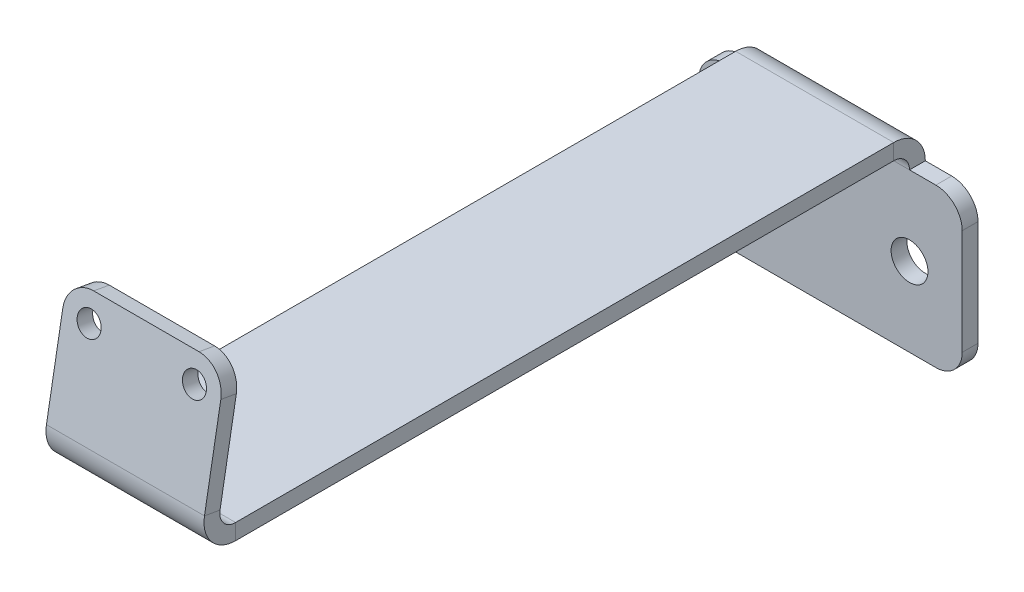
ISO-10303-21;
HEADER;
FILE_DESCRIPTION(('STEP AP214'),'2;1');
FILE_NAME('part.step','',(''),(''),'','','');
FILE_SCHEMA(('AUTOMOTIVE_DESIGN { 1 0 10303 214 1 1 1 1 }'));
ENDSEC;
DATA;
#1=APPLICATION_CONTEXT('core data for automotive mechanical design processes');
#2=APPLICATION_PROTOCOL_DEFINITION('international standard','automotive_design',2000,#1);
#3=PRODUCT_CONTEXT('',#1,'mechanical');
#4=PRODUCT('Part','Part','',(#3));
#5=PRODUCT_RELATED_PRODUCT_CATEGORY('part','',(#4));
#6=PRODUCT_DEFINITION_FORMATION('','',#4);
#7=PRODUCT_DEFINITION_CONTEXT('part definition',#1,'design');
#8=PRODUCT_DEFINITION('design','',#6,#7);
#9=PRODUCT_DEFINITION_SHAPE('','',#8);
#10=(LENGTH_UNIT() NAMED_UNIT(*) SI_UNIT(.MILLI.,.METRE.));
#11=(NAMED_UNIT(*) PLANE_ANGLE_UNIT() SI_UNIT($,.RADIAN.));
#12=(NAMED_UNIT(*) SI_UNIT($,.STERADIAN.) SOLID_ANGLE_UNIT());
#13=UNCERTAINTY_MEASURE_WITH_UNIT(LENGTH_MEASURE(1.E-05),#10,'distance_accuracy_value','');
#14=(GEOMETRIC_REPRESENTATION_CONTEXT(3) GLOBAL_UNCERTAINTY_ASSIGNED_CONTEXT((#13)) GLOBAL_UNIT_ASSIGNED_CONTEXT((#10,
#11,#12)) REPRESENTATION_CONTEXT('',''));
#15=CARTESIAN_POINT('',(0.,0.,0.));
#16=DIRECTION('',(0.,0.,1.));
#17=DIRECTION('',(1.,0.,0.));
#18=AXIS2_PLACEMENT_3D('',#15,#16,#17);
#19=CARTESIAN_POINT('',(0.,36.0000000000001,-34.068583470577));
#20=DIRECTION('',(0.,-1.,0.));
#21=DIRECTION('',(1.,0.,0.));
#22=AXIS2_PLACEMENT_3D('',#19,#20,#21);
#23=PLANE('',#22);
#24=DIRECTION('',(0.,0.,1.));
#25=VECTOR('',#24,1.);
#26=CARTESIAN_POINT('',(15.,36.,-4.06858347057704));
#27=LINE('',#26,#25);
#28=CARTESIAN_POINT('',(15.,36.,3.00000000000002));
#29=VERTEX_POINT('',#28);
#30=CARTESIAN_POINT('',(15.,35.9999999999995,127.931416529423));
#31=VERTEX_POINT('',#30);
#32=EDGE_CURVE('E317',#29,#31,#27,.T.);
#33=ORIENTED_EDGE('',*,*,#32,.F.);
#34=DIRECTION('',(-1.,0.,0.));
#35=VECTOR('',#34,1.);
#36=CARTESIAN_POINT('',(0.,36.,3.00000000000002));
#37=LINE('',#36,#35);
#38=CARTESIAN_POINT('',(-15.,36.,3.00000000000002));
#39=VERTEX_POINT('',#38);
#40=EDGE_CURVE('E324',#29,#39,#37,.T.);
#41=ORIENTED_EDGE('',*,*,#40,.T.);
#42=DIRECTION('',(0.,0.,-1.));
#43=VECTOR('',#42,1.);
#44=CARTESIAN_POINT('',(-15.,36.,-4.06858347057704));
#45=LINE('',#44,#43);
#46=CARTESIAN_POINT('',(-15.,35.9999999999995,127.931416529423));
#47=VERTEX_POINT('',#46);
#48=EDGE_CURVE('E319',#47,#39,#45,.T.);
#49=ORIENTED_EDGE('',*,*,#48,.F.);
#50=DIRECTION('',(-1.,0.,0.));
#51=VECTOR('',#50,1.);
#52=CARTESIAN_POINT('',(15.,35.9999999999996,127.931416529423));
#53=LINE('',#52,#51);
#54=EDGE_CURVE('E314',#31,#47,#53,.T.);
#55=ORIENTED_EDGE('',*,*,#54,.F.);
#56=EDGE_LOOP('',(#33,#41,#49,#55));
#57=FACE_BOUND('',#56,.T.);
#58=ADVANCED_FACE('F67',(#57),#23,.F.);
#59=CARTESIAN_POINT('',(-15.,36.,-4.06858347057704));
#60=DIRECTION('',(-1.,0.,0.));
#61=DIRECTION('',(0.,0.,-1.));
#62=AXIS2_PLACEMENT_3D('',#59,#60,#61);
#63=PLANE('',#62);
#64=DIRECTION('',(0.,1.,0.));
#65=VECTOR('',#64,1.);
#66=CARTESIAN_POINT('',(-15.,36.,3.00000000000002));
#67=LINE('',#66,#65);
#68=CARTESIAN_POINT('',(-15.,33.,3.00000000000001));
#69=VERTEX_POINT('',#68);
#70=EDGE_CURVE('E333',#69,#39,#67,.T.);
#71=ORIENTED_EDGE('',*,*,#70,.F.);
#72=DIRECTION('',(0.,0.,-1.));
#73=VECTOR('',#72,1.);
#74=CARTESIAN_POINT('',(-15.,33.,-4.06858347057705));
#75=LINE('',#74,#73);
#76=CARTESIAN_POINT('',(-15.,32.9999999999996,127.931416529423));
#77=VERTEX_POINT('',#76);
#78=EDGE_CURVE('E267',#77,#69,#75,.T.);
#79=ORIENTED_EDGE('',*,*,#78,.F.);
#80=DIRECTION('',(0.,-1.,0.));
#81=VECTOR('',#80,1.);
#82=CARTESIAN_POINT('',(-15.,35.9999999999996,127.931416529423));
#83=LINE('',#82,#81);
#84=EDGE_CURVE('E321',#47,#77,#83,.T.);
#85=ORIENTED_EDGE('',*,*,#84,.F.);
#86=ORIENTED_EDGE('',*,*,#48,.T.);
#87=EDGE_LOOP('',(#71,#79,#85,#86));
#88=FACE_BOUND('',#87,.T.);
#89=ADVANCED_FACE('F441',(#88),#63,.T.);
#90=CARTESIAN_POINT('',(15.,36.,-4.06858347057704));
#91=DIRECTION('',(1.,0.,0.));
#92=DIRECTION('',(0.,0.,1.));
#93=AXIS2_PLACEMENT_3D('',#90,#91,#92);
#94=PLANE('',#93);
#95=DIRECTION('',(0.,-1.,0.));
#96=VECTOR('',#95,1.);
#97=CARTESIAN_POINT('',(15.,36.,3.00000000000002));
#98=LINE('',#97,#96);
#99=CARTESIAN_POINT('',(15.,33.,3.00000000000001));
#100=VERTEX_POINT('',#99);
#101=EDGE_CURVE('E329',#29,#100,#98,.T.);
#102=ORIENTED_EDGE('',*,*,#101,.F.);
#103=ORIENTED_EDGE('',*,*,#32,.T.);
#104=DIRECTION('',(0.,-1.,0.));
#105=VECTOR('',#104,1.);
#106=CARTESIAN_POINT('',(15.,35.9999999999996,127.931416529423));
#107=LINE('',#106,#105);
#108=CARTESIAN_POINT('',(15.,32.9999999999995,127.931416529423));
#109=VERTEX_POINT('',#108);
#110=EDGE_CURVE('E316',#31,#109,#107,.T.);
#111=ORIENTED_EDGE('',*,*,#110,.T.);
#112=DIRECTION('',(0.,0.,1.));
#113=VECTOR('',#112,1.);
#114=CARTESIAN_POINT('',(15.,33.,-4.06858347057705));
#115=LINE('',#114,#113);
#116=EDGE_CURVE('E320',#100,#109,#115,.T.);
#117=ORIENTED_EDGE('',*,*,#116,.F.);
#118=EDGE_LOOP('',(#102,#103,#111,#117));
#119=FACE_BOUND('',#118,.T.);
#120=ADVANCED_FACE('F448',(#119),#94,.T.);
#121=CARTESIAN_POINT('',(0.,33.0000000000001,-34.068583470577));
#122=DIRECTION('',(0.,-1.,0.));
#123=DIRECTION('',(1.,0.,0.));
#124=AXIS2_PLACEMENT_3D('',#121,#122,#123);
#125=PLANE('',#124);
#126=DIRECTION('',(-1.,0.,0.));
#127=VECTOR('',#126,1.);
#128=CARTESIAN_POINT('',(0.,33.,3.));
#129=LINE('',#128,#127);
#130=EDGE_CURVE('E331',#100,#69,#129,.T.);
#131=ORIENTED_EDGE('',*,*,#130,.F.);
#132=ORIENTED_EDGE('',*,*,#116,.T.);
#133=DIRECTION('',(-1.,0.,0.));
#134=VECTOR('',#133,1.);
#135=CARTESIAN_POINT('',(15.,32.9999999999996,127.931416529423));
#136=LINE('',#135,#134);
#137=EDGE_CURVE('E222',#109,#77,#136,.T.);
#138=ORIENTED_EDGE('',*,*,#137,.T.);
#139=ORIENTED_EDGE('',*,*,#78,.T.);
#140=EDGE_LOOP('',(#131,#132,#138,#139));
#141=FACE_BOUND('',#140,.T.);
#142=ADVANCED_FACE('F458',(#141),#125,.T.);
#143=CARTESIAN_POINT('',(15.,15.,0.));
#144=DIRECTION('',(0.,0.,1.));
#145=DIRECTION('',(1.,0.,0.));
#146=AXIS2_PLACEMENT_3D('',#143,#144,#145);
#147=CYLINDRICAL_SURFACE('',#146,3.5);
#148=CARTESIAN_POINT('',(15.,15.,-3.));
#149=DIRECTION('',(0.,0.,1.));
#150=DIRECTION('',(1.,0.,0.));
#151=AXIS2_PLACEMENT_3D('',#148,#149,#150);
#152=CIRCLE('',#151,3.5);
#153=CARTESIAN_POINT('',(18.5,15.,-3.));
#154=VERTEX_POINT('',#153);
#155=EDGE_CURVE('E290',#154,#154,#152,.T.);
#156=ORIENTED_EDGE('',*,*,#155,.F.);
#157=EDGE_LOOP('',(#156));
#158=FACE_BOUND('',#157,.T.);
#159=CARTESIAN_POINT('',(15.,15.,0.));
#160=DIRECTION('',(0.,0.,1.));
#161=DIRECTION('',(1.,0.,0.));
#162=AXIS2_PLACEMENT_3D('',#159,#160,#161);
#163=CIRCLE('',#162,3.5);
#164=CARTESIAN_POINT('',(18.5,15.,0.));
#165=VERTEX_POINT('',#164);
#166=EDGE_CURVE('E308',#165,#165,#163,.T.);
#167=ORIENTED_EDGE('',*,*,#166,.T.);
#168=EDGE_LOOP('',(#167));
#169=FACE_BOUND('',#168,.T.);
#170=ADVANCED_FACE('F461',(#158,#169),#147,.F.);
#171=CARTESIAN_POINT('',(-15.,15.,0.));
#172=DIRECTION('',(0.,0.,1.));
#173=DIRECTION('',(1.,0.,0.));
#174=AXIS2_PLACEMENT_3D('',#171,#172,#173);
#175=CYLINDRICAL_SURFACE('',#174,3.5);
#176=CARTESIAN_POINT('',(-15.,15.,-3.));
#177=DIRECTION('',(0.,0.,1.));
#178=DIRECTION('',(1.,0.,0.));
#179=AXIS2_PLACEMENT_3D('',#176,#177,#178);
#180=CIRCLE('',#179,3.5);
#181=CARTESIAN_POINT('',(-11.5,15.,-3.));
#182=VERTEX_POINT('',#181);
#183=EDGE_CURVE('E293',#182,#182,#180,.T.);
#184=ORIENTED_EDGE('',*,*,#183,.F.);
#185=EDGE_LOOP('',(#184));
#186=FACE_BOUND('',#185,.T.);
#187=CARTESIAN_POINT('',(-15.,15.,0.));
#188=DIRECTION('',(0.,0.,1.));
#189=DIRECTION('',(1.,0.,0.));
#190=AXIS2_PLACEMENT_3D('',#187,#188,#189);
#191=CIRCLE('',#190,3.5);
#192=CARTESIAN_POINT('',(-11.5,15.,0.));
#193=VERTEX_POINT('',#192);
#194=EDGE_CURVE('E305',#193,#193,#191,.T.);
#195=ORIENTED_EDGE('',*,*,#194,.T.);
#196=EDGE_LOOP('',(#195));
#197=FACE_BOUND('',#196,.T.);
#198=ADVANCED_FACE('F568',(#186,#197),#175,.F.);
#199=CARTESIAN_POINT('',(-25.,0.,-3.));
#200=DIRECTION('',(-1.,0.,0.));
#201=DIRECTION('',(0.,0.,1.));
#202=AXIS2_PLACEMENT_3D('',#199,#200,#201);
#203=PLANE('',#202);
#204=DIRECTION('',(0.,-1.,0.));
#205=VECTOR('',#204,1.);
#206=CARTESIAN_POINT('',(-25.,0.,-3.));
#207=LINE('',#206,#205);
#208=CARTESIAN_POINT('',(-25.,25.,-3.));
#209=VERTEX_POINT('',#208);
#210=CARTESIAN_POINT('',(-25.,5.,-3.));
#211=VERTEX_POINT('',#210);
#212=EDGE_CURVE('E302',#209,#211,#207,.T.);
#213=ORIENTED_EDGE('',*,*,#212,.T.);
#214=DIRECTION('',(0.,0.,1.));
#215=VECTOR('',#214,1.);
#216=CARTESIAN_POINT('',(-25.,5.,-3.));
#217=LINE('',#216,#215);
#218=CARTESIAN_POINT('',(-25.,5.,0.));
#219=VERTEX_POINT('',#218);
#220=EDGE_CURVE('E345',#211,#219,#217,.T.);
#221=ORIENTED_EDGE('',*,*,#220,.T.);
#222=DIRECTION('',(0.,-1.,0.));
#223=VECTOR('',#222,1.);
#224=CARTESIAN_POINT('',(-25.,0.,0.));
#225=LINE('',#224,#223);
#226=CARTESIAN_POINT('',(-25.,25.,0.));
#227=VERTEX_POINT('',#226);
#228=EDGE_CURVE('E274',#227,#219,#225,.T.);
#229=ORIENTED_EDGE('',*,*,#228,.F.);
#230=DIRECTION('',(0.,0.,1.));
#231=VECTOR('',#230,1.);
#232=CARTESIAN_POINT('',(-25.,25.,-3.));
#233=LINE('',#232,#231);
#234=EDGE_CURVE('E336',#227,#209,#233,.F.);
#235=ORIENTED_EDGE('',*,*,#234,.T.);
#236=EDGE_LOOP('',(#213,#221,#229,#235));
#237=FACE_BOUND('',#236,.T.);
#238=ADVANCED_FACE('F539',(#237),#203,.T.);
#239=CARTESIAN_POINT('',(-25.,0.,-3.));
#240=DIRECTION('',(0.,-1.,0.));
#241=DIRECTION('',(1.,0.,0.));
#242=AXIS2_PLACEMENT_3D('',#239,#240,#241);
#243=PLANE('',#242);
#244=DIRECTION('',(1.,0.,0.));
#245=VECTOR('',#244,1.);
#246=CARTESIAN_POINT('',(-25.,0.,0.));
#247=LINE('',#246,#245);
#248=CARTESIAN_POINT('',(-20.,0.,0.));
#249=VERTEX_POINT('',#248);
#250=CARTESIAN_POINT('',(20.,0.,0.));
#251=VERTEX_POINT('',#250);
#252=EDGE_CURVE('E271',#249,#251,#247,.T.);
#253=ORIENTED_EDGE('',*,*,#252,.F.);
#254=DIRECTION('',(0.,0.,1.));
#255=VECTOR('',#254,1.);
#256=CARTESIAN_POINT('',(-20.,0.,-3.));
#257=LINE('',#256,#255);
#258=CARTESIAN_POINT('',(-20.,0.,-3.));
#259=VERTEX_POINT('',#258);
#260=EDGE_CURVE('E359',#249,#259,#257,.F.);
#261=ORIENTED_EDGE('',*,*,#260,.T.);
#262=DIRECTION('',(1.,0.,0.));
#263=VECTOR('',#262,1.);
#264=CARTESIAN_POINT('',(-25.,0.,-3.));
#265=LINE('',#264,#263);
#266=CARTESIAN_POINT('',(20.,0.,-3.));
#267=VERTEX_POINT('',#266);
#268=EDGE_CURVE('E299',#259,#267,#265,.T.);
#269=ORIENTED_EDGE('',*,*,#268,.T.);
#270=DIRECTION('',(0.,0.,1.));
#271=VECTOR('',#270,1.);
#272=CARTESIAN_POINT('',(20.,0.,-3.));
#273=LINE('',#272,#271);
#274=EDGE_CURVE('E356',#267,#251,#273,.T.);
#275=ORIENTED_EDGE('',*,*,#274,.T.);
#276=EDGE_LOOP('',(#253,#261,#269,#275));
#277=FACE_BOUND('',#276,.T.);
#278=ADVANCED_FACE('F532',(#277),#243,.T.);
#279=CARTESIAN_POINT('',(25.,0.,-3.));
#280=DIRECTION('',(1.,0.,0.));
#281=DIRECTION('',(0.,1.,0.));
#282=AXIS2_PLACEMENT_3D('',#279,#280,#281);
#283=PLANE('',#282);
#284=DIRECTION('',(0.,1.,0.));
#285=VECTOR('',#284,1.);
#286=CARTESIAN_POINT('',(25.,0.,0.));
#287=LINE('',#286,#285);
#288=CARTESIAN_POINT('',(25.,5.00000000000001,0.));
#289=VERTEX_POINT('',#288);
#290=CARTESIAN_POINT('',(25.,25.,0.));
#291=VERTEX_POINT('',#290);
#292=EDGE_CURVE('E268',#289,#291,#287,.T.);
#293=ORIENTED_EDGE('',*,*,#292,.F.);
#294=DIRECTION('',(0.,0.,1.));
#295=VECTOR('',#294,1.);
#296=CARTESIAN_POINT('',(25.,5.00000000000001,-3.));
#297=LINE('',#296,#295);
#298=CARTESIAN_POINT('',(25.,5.00000000000001,-3.));
#299=VERTEX_POINT('',#298);
#300=EDGE_CURVE('E372',#289,#299,#297,.F.);
#301=ORIENTED_EDGE('',*,*,#300,.T.);
#302=DIRECTION('',(0.,1.,0.));
#303=VECTOR('',#302,1.);
#304=CARTESIAN_POINT('',(25.,0.,-3.));
#305=LINE('',#304,#303);
#306=CARTESIAN_POINT('',(25.,25.,-3.));
#307=VERTEX_POINT('',#306);
#308=EDGE_CURVE('E296',#299,#307,#305,.T.);
#309=ORIENTED_EDGE('',*,*,#308,.T.);
#310=DIRECTION('',(0.,0.,1.));
#311=VECTOR('',#310,1.);
#312=CARTESIAN_POINT('',(25.,25.,-3.));
#313=LINE('',#312,#311);
#314=EDGE_CURVE('E369',#307,#291,#313,.T.);
#315=ORIENTED_EDGE('',*,*,#314,.T.);
#316=EDGE_LOOP('',(#293,#301,#309,#315));
#317=FACE_BOUND('',#316,.T.);
#318=ADVANCED_FACE('F524',(#317),#283,.T.);
#319=CARTESIAN_POINT('',(0.,0.,-3.));
#320=DIRECTION('',(0.,0.,1.));
#321=DIRECTION('',(1.,0.,0.));
#322=AXIS2_PLACEMENT_3D('',#319,#320,#321);
#323=PLANE('',#322);
#324=ORIENTED_EDGE('',*,*,#268,.F.);
#325=CARTESIAN_POINT('',(-20.,5.,-3.));
#326=DIRECTION('',(0.,0.,1.));
#327=DIRECTION('',(1.,0.,0.));
#328=AXIS2_PLACEMENT_3D('',#325,#326,#327);
#329=CIRCLE('',#328,5.);
#330=EDGE_CURVE('E367',#259,#211,#329,.F.);
#331=ORIENTED_EDGE('',*,*,#330,.T.);
#332=ORIENTED_EDGE('',*,*,#212,.F.);
#333=CARTESIAN_POINT('',(-20.,25.,-3.));
#334=DIRECTION('',(0.,0.,1.));
#335=DIRECTION('',(1.,0.,0.));
#336=AXIS2_PLACEMENT_3D('',#333,#334,#335);
#337=CIRCLE('',#336,5.);
#338=CARTESIAN_POINT('',(-20.,30.,-3.));
#339=VERTEX_POINT('',#338);
#340=EDGE_CURVE('E361',#209,#339,#337,.F.);
#341=ORIENTED_EDGE('',*,*,#340,.T.);
#342=DIRECTION('',(-1.,0.,0.));
#343=VECTOR('',#342,1.);
#344=CARTESIAN_POINT('',(-25.,30.,-3.));
#345=LINE('',#344,#343);
#346=CARTESIAN_POINT('',(-15.,30.,-3.));
#347=VERTEX_POINT('',#346);
#348=EDGE_CURVE('E264',#347,#339,#345,.T.);
#349=ORIENTED_EDGE('',*,*,#348,.F.);
#350=DIRECTION('',(-1.,0.,0.));
#351=VECTOR('',#350,1.);
#352=CARTESIAN_POINT('',(0.,30.,-3.));
#353=LINE('',#352,#351);
#354=CARTESIAN_POINT('',(15.,30.,-3.));
#355=VERTEX_POINT('',#354);
#356=EDGE_CURVE('E259',#355,#347,#353,.T.);
#357=ORIENTED_EDGE('',*,*,#356,.F.);
#358=DIRECTION('',(-1.,0.,0.));
#359=VECTOR('',#358,1.);
#360=CARTESIAN_POINT('',(25.,30.,-3.));
#361=LINE('',#360,#359);
#362=CARTESIAN_POINT('',(20.,30.,-3.));
#363=VERTEX_POINT('',#362);
#364=EDGE_CURVE('E288',#363,#355,#361,.T.);
#365=ORIENTED_EDGE('',*,*,#364,.F.);
#366=CARTESIAN_POINT('',(20.,25.,-3.));
#367=DIRECTION('',(0.,0.,1.));
#368=DIRECTION('',(1.,0.,0.));
#369=AXIS2_PLACEMENT_3D('',#366,#367,#368);
#370=CIRCLE('',#369,5.);
#371=EDGE_CURVE('E363',#363,#307,#370,.F.);
#372=ORIENTED_EDGE('',*,*,#371,.T.);
#373=ORIENTED_EDGE('',*,*,#308,.F.);
#374=CARTESIAN_POINT('',(20.,5.00000000000001,-3.));
#375=DIRECTION('',(0.,0.,1.));
#376=DIRECTION('',(1.,0.,0.));
#377=AXIS2_PLACEMENT_3D('',#374,#375,#376);
#378=CIRCLE('',#377,5.);
#379=EDGE_CURVE('E365',#299,#267,#378,.F.);
#380=ORIENTED_EDGE('',*,*,#379,.T.);
#381=EDGE_LOOP('',(#324,#331,#332,#341,#349,#357,#365,#372,#373,#380));
#382=FACE_BOUND('',#381,.T.);
#383=ORIENTED_EDGE('',*,*,#183,.T.);
#384=EDGE_LOOP('',(#383));
#385=FACE_BOUND('',#384,.T.);
#386=ORIENTED_EDGE('',*,*,#155,.T.);
#387=EDGE_LOOP('',(#386));
#388=FACE_BOUND('',#387,.T.);
#389=ADVANCED_FACE('F517',(#382,#385,#388),#323,.F.);
#390=CARTESIAN_POINT('',(25.,30.,-3.));
#391=DIRECTION('',(0.,1.,0.));
#392=DIRECTION('',(-1.,0.,0.));
#393=AXIS2_PLACEMENT_3D('',#390,#391,#392);
#394=PLANE('',#393);
#395=DIRECTION('',(-1.,0.,0.));
#396=VECTOR('',#395,1.);
#397=CARTESIAN_POINT('',(25.,30.,0.));
#398=LINE('',#397,#396);
#399=CARTESIAN_POINT('',(20.,30.,0.));
#400=VERTEX_POINT('',#399);
#401=CARTESIAN_POINT('',(15.,30.,0.));
#402=VERTEX_POINT('',#401);
#403=EDGE_CURVE('E283',#400,#402,#398,.T.);
#404=ORIENTED_EDGE('',*,*,#403,.F.);
#405=DIRECTION('',(0.,0.,1.));
#406=VECTOR('',#405,1.);
#407=CARTESIAN_POINT('',(20.,30.,-3.));
#408=LINE('',#407,#406);
#409=EDGE_CURVE('E374',#400,#363,#408,.F.);
#410=ORIENTED_EDGE('',*,*,#409,.T.);
#411=ORIENTED_EDGE('',*,*,#364,.T.);
#412=DIRECTION('',(0.,0.,1.));
#413=VECTOR('',#412,1.);
#414=CARTESIAN_POINT('',(15.,30.,-3.));
#415=LINE('',#414,#413);
#416=EDGE_CURVE('E285',#355,#402,#415,.T.);
#417=ORIENTED_EDGE('',*,*,#416,.T.);
#418=EDGE_LOOP('',(#404,#410,#411,#417));
#419=FACE_BOUND('',#418,.T.);
#420=ADVANCED_FACE('F511',(#419),#394,.T.);
#421=CARTESIAN_POINT('',(0.,0.,0.));
#422=DIRECTION('',(0.,0.,1.));
#423=DIRECTION('',(1.,0.,0.));
#424=AXIS2_PLACEMENT_3D('',#421,#422,#423);
#425=PLANE('',#424);
#426=ORIENTED_EDGE('',*,*,#194,.F.);
#427=EDGE_LOOP('',(#426));
#428=FACE_BOUND('',#427,.T.);
#429=ORIENTED_EDGE('',*,*,#166,.F.);
#430=EDGE_LOOP('',(#429));
#431=FACE_BOUND('',#430,.T.);
#432=ORIENTED_EDGE('',*,*,#228,.T.);
#433=CARTESIAN_POINT('',(-20.,5.,0.));
#434=DIRECTION('',(0.,0.,1.));
#435=DIRECTION('',(1.,0.,0.));
#436=AXIS2_PLACEMENT_3D('',#433,#434,#435);
#437=CIRCLE('',#436,5.);
#438=EDGE_CURVE('E354',#219,#249,#437,.T.);
#439=ORIENTED_EDGE('',*,*,#438,.T.);
#440=ORIENTED_EDGE('',*,*,#252,.T.);
#441=CARTESIAN_POINT('',(20.,5.00000000000001,0.));
#442=DIRECTION('',(0.,0.,1.));
#443=DIRECTION('',(1.,0.,0.));
#444=AXIS2_PLACEMENT_3D('',#441,#442,#443);
#445=CIRCLE('',#444,5.);
#446=EDGE_CURVE('E352',#251,#289,#445,.T.);
#447=ORIENTED_EDGE('',*,*,#446,.T.);
#448=ORIENTED_EDGE('',*,*,#292,.T.);
#449=CARTESIAN_POINT('',(20.,25.,0.));
#450=DIRECTION('',(0.,0.,1.));
#451=DIRECTION('',(1.,0.,0.));
#452=AXIS2_PLACEMENT_3D('',#449,#450,#451);
#453=CIRCLE('',#452,5.);
#454=EDGE_CURVE('E350',#291,#400,#453,.T.);
#455=ORIENTED_EDGE('',*,*,#454,.T.);
#456=ORIENTED_EDGE('',*,*,#403,.T.);
#457=DIRECTION('',(-1.,0.,0.));
#458=VECTOR('',#457,1.);
#459=CARTESIAN_POINT('',(0.,30.,0.));
#460=LINE('',#459,#458);
#461=CARTESIAN_POINT('',(-15.,30.,0.));
#462=VERTEX_POINT('',#461);
#463=EDGE_CURVE('E280',#402,#462,#460,.T.);
#464=ORIENTED_EDGE('',*,*,#463,.T.);
#465=DIRECTION('',(-1.,0.,0.));
#466=VECTOR('',#465,1.);
#467=CARTESIAN_POINT('',(-25.,30.,0.));
#468=LINE('',#467,#466);
#469=CARTESIAN_POINT('',(-20.,30.,0.));
#470=VERTEX_POINT('',#469);
#471=EDGE_CURVE('E277',#462,#470,#468,.T.);
#472=ORIENTED_EDGE('',*,*,#471,.T.);
#473=CARTESIAN_POINT('',(-20.,25.,0.));
#474=DIRECTION('',(0.,0.,1.));
#475=DIRECTION('',(1.,0.,0.));
#476=AXIS2_PLACEMENT_3D('',#473,#474,#475);
#477=CIRCLE('',#476,5.);
#478=EDGE_CURVE('E348',#470,#227,#477,.T.);
#479=ORIENTED_EDGE('',*,*,#478,.T.);
#480=EDGE_LOOP('',(#432,#439,#440,#447,#448,#455,#456,#464,#472,#479));
#481=FACE_BOUND('',#480,.T.);
#482=ADVANCED_FACE('F527',(#428,#431,#481),#425,.T.);
#483=CARTESIAN_POINT('',(-25.,30.,-3.));
#484=DIRECTION('',(0.,1.,0.));
#485=DIRECTION('',(0.,0.,1.));
#486=AXIS2_PLACEMENT_3D('',#483,#484,#485);
#487=PLANE('',#486);
#488=ORIENTED_EDGE('',*,*,#348,.T.);
#489=DIRECTION('',(0.,0.,1.));
#490=VECTOR('',#489,1.);
#491=CARTESIAN_POINT('',(-20.,30.,-3.));
#492=LINE('',#491,#490);
#493=EDGE_CURVE('E376',#339,#470,#492,.T.);
#494=ORIENTED_EDGE('',*,*,#493,.T.);
#495=ORIENTED_EDGE('',*,*,#471,.F.);
#496=DIRECTION('',(0.,0.,1.));
#497=VECTOR('',#496,1.);
#498=CARTESIAN_POINT('',(-15.,30.,-3.));
#499=LINE('',#498,#497);
#500=EDGE_CURVE('E311',#347,#462,#499,.T.);
#501=ORIENTED_EDGE('',*,*,#500,.F.);
#502=EDGE_LOOP('',(#488,#494,#495,#501));
#503=FACE_BOUND('',#502,.T.);
#504=ADVANCED_FACE('F454',(#503),#487,.T.);
#505=CARTESIAN_POINT('',(15.,30.,3.));
#506=DIRECTION('',(1.,0.,0.));
#507=DIRECTION('',(0.,0.,-1.));
#508=AXIS2_PLACEMENT_3D('',#505,#506,#507);
#509=PLANE('',#508);
#510=ORIENTED_EDGE('',*,*,#101,.T.);
#511=CARTESIAN_POINT('',(15.,30.,3.));
#512=DIRECTION('',(1.,0.,0.));
#513=DIRECTION('',(0.,1.,0.));
#514=AXIS2_PLACEMENT_3D('',#511,#512,#513);
#515=CIRCLE('',#514,3.);
#516=EDGE_CURVE('E248',#100,#402,#515,.F.);
#517=ORIENTED_EDGE('',*,*,#516,.T.);
#518=ORIENTED_EDGE('',*,*,#416,.F.);
#519=CARTESIAN_POINT('',(15.,30.,3.));
#520=DIRECTION('',(-1.,0.,0.));
#521=DIRECTION('',(0.,0.,-1.));
#522=AXIS2_PLACEMENT_3D('',#519,#520,#521);
#523=CIRCLE('',#522,6.);
#524=EDGE_CURVE('E253',#29,#355,#523,.T.);
#525=ORIENTED_EDGE('',*,*,#524,.F.);
#526=EDGE_LOOP('',(#510,#517,#518,#525));
#527=FACE_BOUND('',#526,.T.);
#528=ADVANCED_FACE('F506',(#527),#509,.T.);
#529=CARTESIAN_POINT('',(-15.,30.,3.));
#530=DIRECTION('',(-1.,0.,0.));
#531=DIRECTION('',(0.,0.,1.));
#532=AXIS2_PLACEMENT_3D('',#529,#530,#531);
#533=PLANE('',#532);
#534=CARTESIAN_POINT('',(-15.,30.,3.));
#535=DIRECTION('',(1.,0.,0.));
#536=DIRECTION('',(0.,1.,0.));
#537=AXIS2_PLACEMENT_3D('',#534,#535,#536);
#538=CIRCLE('',#537,3.);
#539=EDGE_CURVE('E257',#462,#69,#538,.T.);
#540=ORIENTED_EDGE('',*,*,#539,.T.);
#541=ORIENTED_EDGE('',*,*,#70,.T.);
#542=CARTESIAN_POINT('',(-15.,30.,3.));
#543=DIRECTION('',(1.,0.,0.));
#544=DIRECTION('',(0.,0.,1.));
#545=AXIS2_PLACEMENT_3D('',#542,#543,#544);
#546=CIRCLE('',#545,6.);
#547=EDGE_CURVE('E256',#347,#39,#546,.T.);
#548=ORIENTED_EDGE('',*,*,#547,.F.);
#549=ORIENTED_EDGE('',*,*,#500,.T.);
#550=EDGE_LOOP('',(#540,#541,#548,#549));
#551=FACE_BOUND('',#550,.T.);
#552=ADVANCED_FACE('F548',(#551),#533,.T.);
#553=CARTESIAN_POINT('',(-30.9671579625983,30.,3.));
#554=DIRECTION('',(1.,0.,0.));
#555=DIRECTION('',(0.,1.,0.));
#556=AXIS2_PLACEMENT_3D('',#553,#554,#555);
#557=CYLINDRICAL_SURFACE('',#556,6.);
#558=ORIENTED_EDGE('',*,*,#356,.T.);
#559=ORIENTED_EDGE('',*,*,#547,.T.);
#560=ORIENTED_EDGE('',*,*,#40,.F.);
#561=ORIENTED_EDGE('',*,*,#524,.T.);
#562=EDGE_LOOP('',(#558,#559,#560,#561));
#563=FACE_BOUND('',#562,.T.);
#564=ADVANCED_FACE('F501',(#563),#557,.T.);
#565=CARTESIAN_POINT('',(-30.9671579625983,30.,3.));
#566=DIRECTION('',(1.,0.,0.));
#567=DIRECTION('',(0.,1.,0.));
#568=AXIS2_PLACEMENT_3D('',#565,#566,#567);
#569=CYLINDRICAL_SURFACE('',#568,3.);
#570=ORIENTED_EDGE('',*,*,#463,.F.);
#571=ORIENTED_EDGE('',*,*,#516,.F.);
#572=ORIENTED_EDGE('',*,*,#130,.T.);
#573=ORIENTED_EDGE('',*,*,#539,.F.);
#574=EDGE_LOOP('',(#570,#571,#572,#573));
#575=FACE_BOUND('',#574,.T.);
#576=ADVANCED_FACE('F550',(#575),#569,.F.);
#577=CARTESIAN_POINT('',(-15.,38.9999999999995,127.931416529423));
#578=DIRECTION('',(-1.,0.,0.));
#579=DIRECTION('',(0.,0.,1.));
#580=AXIS2_PLACEMENT_3D('',#577,#578,#579);
#581=PLANE('',#580);
#582=DIRECTION('',(0.,0.173648177666924,0.984807753012209));
#583=VECTOR('',#582,1.);
#584=CARTESIAN_POINT('',(-15.,40.0418890660011,133.840263047496));
#585=LINE('',#584,#583);
#586=CARTESIAN_POINT('',(-15.,39.5209445330003,130.88583978846));
#587=VERTEX_POINT('',#586);
#588=CARTESIAN_POINT('',(-15.,40.0418890660011,133.840263047496));
#589=VERTEX_POINT('',#588);
#590=EDGE_CURVE('E244',#587,#589,#585,.T.);
#591=ORIENTED_EDGE('',*,*,#590,.F.);
#592=CARTESIAN_POINT('',(-15.,38.9999999999995,127.931416529423));
#593=DIRECTION('',(1.,0.,0.));
#594=DIRECTION('',(0.,0.,-1.));
#595=AXIS2_PLACEMENT_3D('',#592,#593,#594);
#596=CIRCLE('',#595,3.00000000000001);
#597=EDGE_CURVE('E226',#47,#587,#596,.F.);
#598=ORIENTED_EDGE('',*,*,#597,.F.);
#599=ORIENTED_EDGE('',*,*,#84,.T.);
#600=CARTESIAN_POINT('',(-15.,38.9999999999995,127.931416529423));
#601=DIRECTION('',(1.,0.,0.));
#602=DIRECTION('',(0.,0.,-1.));
#603=AXIS2_PLACEMENT_3D('',#600,#601,#602);
#604=CIRCLE('',#603,6.00000000000001);
#605=EDGE_CURVE('E225',#77,#589,#604,.F.);
#606=ORIENTED_EDGE('',*,*,#605,.T.);
#607=EDGE_LOOP('',(#591,#598,#599,#606));
#608=FACE_BOUND('',#607,.T.);
#609=ADVANCED_FACE('F494',(#608),#581,.T.);
#610=CARTESIAN_POINT('',(15.,38.9999999999995,127.931416529423));
#611=DIRECTION('',(-1.,0.,0.));
#612=DIRECTION('',(0.,0.,1.));
#613=AXIS2_PLACEMENT_3D('',#610,#611,#612);
#614=PLANE('',#613);
#615=CARTESIAN_POINT('',(15.,38.9999999999995,127.931416529423));
#616=DIRECTION('',(1.,0.,0.));
#617=DIRECTION('',(0.,0.,-1.));
#618=AXIS2_PLACEMENT_3D('',#615,#616,#617);
#619=CIRCLE('',#618,3.00000000000001);
#620=CARTESIAN_POINT('',(15.,39.5209445330003,130.88583978846));
#621=VERTEX_POINT('',#620);
#622=EDGE_CURVE('E212',#621,#31,#619,.T.);
#623=ORIENTED_EDGE('',*,*,#622,.F.);
#624=DIRECTION('',(0.,0.173648177666924,0.984807753012209));
#625=VECTOR('',#624,1.);
#626=CARTESIAN_POINT('',(15.,39.5209445330003,130.88583978846));
#627=LINE('',#626,#625);
#628=CARTESIAN_POINT('',(15.,40.0418890660011,133.840263047496));
#629=VERTEX_POINT('',#628);
#630=EDGE_CURVE('E209',#621,#629,#627,.T.);
#631=ORIENTED_EDGE('',*,*,#630,.T.);
#632=CARTESIAN_POINT('',(15.,38.9999999999995,127.931416529423));
#633=DIRECTION('',(1.,0.,0.));
#634=DIRECTION('',(0.,0.,-1.));
#635=AXIS2_PLACEMENT_3D('',#632,#633,#634);
#636=CIRCLE('',#635,6.00000000000001);
#637=EDGE_CURVE('E217',#629,#109,#636,.T.);
#638=ORIENTED_EDGE('',*,*,#637,.T.);
#639=ORIENTED_EDGE('',*,*,#110,.F.);
#640=EDGE_LOOP('',(#623,#631,#638,#639));
#641=FACE_BOUND('',#640,.T.);
#642=ADVANCED_FACE('F229',(#641),#614,.F.);
#643=CARTESIAN_POINT('',(15.,38.9999999999995,127.931416529423));
#644=DIRECTION('',(1.,0.,0.));
#645=DIRECTION('',(0.,0.173648177666924,0.984807753012209));
#646=AXIS2_PLACEMENT_3D('',#643,#644,#645);
#647=CYLINDRICAL_SURFACE('',#646,6.00000000000001);
#648=ORIENTED_EDGE('',*,*,#137,.F.);
#649=ORIENTED_EDGE('',*,*,#637,.F.);
#650=DIRECTION('',(1.,0.,0.));
#651=VECTOR('',#650,1.);
#652=CARTESIAN_POINT('',(0.,40.0418890660011,133.840263047496));
#653=LINE('',#652,#651);
#654=EDGE_CURVE('E219',#589,#629,#653,.T.);
#655=ORIENTED_EDGE('',*,*,#654,.F.);
#656=ORIENTED_EDGE('',*,*,#605,.F.);
#657=EDGE_LOOP('',(#648,#649,#655,#656));
#658=FACE_BOUND('',#657,.T.);
#659=ADVANCED_FACE('F218',(#658),#647,.T.);
#660=CARTESIAN_POINT('',(15.,38.9999999999995,127.931416529423));
#661=DIRECTION('',(1.,0.,0.));
#662=DIRECTION('',(0.,0.173648177666924,0.984807753012209));
#663=AXIS2_PLACEMENT_3D('',#660,#661,#662);
#664=CYLINDRICAL_SURFACE('',#663,3.00000000000001);
#665=ORIENTED_EDGE('',*,*,#54,.T.);
#666=ORIENTED_EDGE('',*,*,#597,.T.);
#667=DIRECTION('',(-1.,0.,0.));
#668=VECTOR('',#667,1.);
#669=CARTESIAN_POINT('',(-15.,39.5209445330003,130.88583978846));
#670=LINE('',#669,#668);
#671=EDGE_CURVE('E231',#587,#621,#670,.F.);
#672=ORIENTED_EDGE('',*,*,#671,.T.);
#673=ORIENTED_EDGE('',*,*,#622,.T.);
#674=EDGE_LOOP('',(#665,#666,#672,#673));
#675=FACE_BOUND('',#674,.T.);
#676=ADVANCED_FACE('F489',(#675),#664,.F.);
#677=CARTESIAN_POINT('',(15.,36.5209445330003,134.461100566242));
#678=DIRECTION('',(1.,0.,0.));
#679=DIRECTION('',(0.,1.,0.));
#680=AXIS2_PLACEMENT_3D('',#677,#678,#679);
#681=PLANE('',#680);
#682=DIRECTION('',(0.,0.984807753012209,-0.173648177666924));
#683=VECTOR('',#682,1.);
#684=CARTESIAN_POINT('',(15.,22.9630935344773,133.80543566205));
#685=LINE('',#684,#683);
#686=CARTESIAN_POINT('',(15.,57.099249292304,127.786310384278));
#687=VERTEX_POINT('',#686);
#688=EDGE_CURVE('E402',#687,#621,#685,.F.);
#689=ORIENTED_EDGE('',*,*,#688,.F.);
#690=DIRECTION('',(0.,-0.173648177666924,-0.984807753012209));
#691=VECTOR('',#690,1.);
#692=CARTESIAN_POINT('',(15.,57.6201938253048,130.740733643315));
#693=LINE('',#692,#691);
#694=CARTESIAN_POINT('',(15.,57.6201938253048,130.740733643315));
#695=VERTEX_POINT('',#694);
#696=EDGE_CURVE('E90',#687,#695,#693,.F.);
#697=ORIENTED_EDGE('',*,*,#696,.T.);
#698=DIRECTION('',(0.,-0.984807753012209,0.173648177666924));
#699=VECTOR('',#698,1.);
#700=CARTESIAN_POINT('',(15.,36.5209445330003,134.461100566242));
#701=LINE('',#700,#699);
#702=EDGE_CURVE('E205',#695,#629,#701,.T.);
#703=ORIENTED_EDGE('',*,*,#702,.T.);
#704=ORIENTED_EDGE('',*,*,#630,.F.);
#705=EDGE_LOOP('',(#689,#697,#703,#704));
#706=FACE_BOUND('',#705,.T.);
#707=ADVANCED_FACE('F207',(#706),#681,.T.);
#708=CARTESIAN_POINT('',(-15.,62.5442325903658,129.87249275498));
#709=DIRECTION('',(-1.,0.,0.));
#710=DIRECTION('',(0.,-1.,0.));
#711=AXIS2_PLACEMENT_3D('',#708,#709,#710);
#712=PLANE('',#711);
#713=DIRECTION('',(0.,0.984807753012209,-0.173648177666924));
#714=VECTOR('',#713,1.);
#715=CARTESIAN_POINT('',(-15.,62.5442325903658,129.87249275498));
#716=LINE('',#715,#714);
#717=CARTESIAN_POINT('',(-15.,57.6201938253048,130.740733643315));
#718=VERTEX_POINT('',#717);
#719=EDGE_CURVE('E234',#589,#718,#716,.T.);
#720=ORIENTED_EDGE('',*,*,#719,.T.);
#721=DIRECTION('',(0.,-0.173648177666924,-0.984807753012209));
#722=VECTOR('',#721,1.);
#723=CARTESIAN_POINT('',(-15.,57.6201938253048,130.740733643315));
#724=LINE('',#723,#722);
#725=CARTESIAN_POINT('',(-15.,57.099249292304,127.786310384278));
#726=VERTEX_POINT('',#725);
#727=EDGE_CURVE('E13',#718,#726,#724,.T.);
#728=ORIENTED_EDGE('',*,*,#727,.T.);
#729=DIRECTION('',(0.,-0.984807753012209,0.173648177666924));
#730=VECTOR('',#729,1.);
#731=CARTESIAN_POINT('',(-15.,22.9630935344773,133.80543566205));
#732=LINE('',#731,#730);
#733=EDGE_CURVE('E235',#587,#726,#732,.F.);
#734=ORIENTED_EDGE('',*,*,#733,.F.);
#735=ORIENTED_EDGE('',*,*,#590,.T.);
#736=EDGE_LOOP('',(#720,#728,#734,#735));
#737=FACE_BOUND('',#736,.T.);
#738=ADVANCED_FACE('F422',(#737),#712,.T.);
#739=CARTESIAN_POINT('',(0.,23.484038067478,136.759858921086));
#740=DIRECTION('',(0.,0.173648177666924,0.984807753012209));
#741=DIRECTION('',(0.,-0.984807753012209,0.173648177666924));
#742=AXIS2_PLACEMENT_3D('',#739,#740,#741);
#743=PLANE('',#742);
#744=CARTESIAN_POINT('',(-10.,57.6201938253048,130.740733643315));
#745=DIRECTION('',(0.,0.173648177666923,0.984807753012209));
#746=DIRECTION('',(0.,-0.984807753012209,0.173648177666923));
#747=AXIS2_PLACEMENT_3D('',#744,#745,#746);
#748=CIRCLE('',#747,2.24999999999999);
#749=CARTESIAN_POINT('',(-10.,55.4043763810273,131.131442043066));
#750=VERTEX_POINT('',#749);
#751=EDGE_CURVE('E414',#750,#750,#748,.T.);
#752=ORIENTED_EDGE('',*,*,#751,.F.);
#753=EDGE_LOOP('',(#752));
#754=FACE_BOUND('',#753,.T.);
#755=CARTESIAN_POINT('',(10.,57.6201938253048,130.740733643315));
#756=DIRECTION('',(0.,0.173648177666923,0.984807753012209));
#757=DIRECTION('',(0.,-0.984807753012209,0.173648177666923));
#758=AXIS2_PLACEMENT_3D('',#755,#756,#757);
#759=CIRCLE('',#758,2.24999999999999);
#760=CARTESIAN_POINT('',(10.,55.4043763810273,131.131442043066));
#761=VERTEX_POINT('',#760);
#762=EDGE_CURVE('E408',#761,#761,#759,.T.);
#763=ORIENTED_EDGE('',*,*,#762,.F.);
#764=EDGE_LOOP('',(#763));
#765=FACE_BOUND('',#764,.T.);
#766=ORIENTED_EDGE('',*,*,#702,.F.);
#767=CARTESIAN_POINT('',(10.,57.6201938253048,130.740733643315));
#768=DIRECTION('',(0.,0.173648177666924,0.984807753012209));
#769=DIRECTION('',(0.,-0.984807753012209,0.173648177666924));
#770=AXIS2_PLACEMENT_3D('',#767,#768,#769);
#771=CIRCLE('',#770,5.);
#772=CARTESIAN_POINT('',(10.,62.5442325903658,129.87249275498));
#773=VERTEX_POINT('',#772);
#774=EDGE_CURVE('E75',#695,#773,#771,.T.);
#775=ORIENTED_EDGE('',*,*,#774,.T.);
#776=DIRECTION('',(1.,0.,0.));
#777=VECTOR('',#776,1.);
#778=CARTESIAN_POINT('',(15.,62.5442325903658,129.87249275498));
#779=LINE('',#778,#777);
#780=CARTESIAN_POINT('',(-10.,62.5442325903658,129.87249275498));
#781=VERTEX_POINT('',#780);
#782=EDGE_CURVE('E213',#781,#773,#779,.T.);
#783=ORIENTED_EDGE('',*,*,#782,.F.);
#784=CARTESIAN_POINT('',(-10.,57.6201938253048,130.740733643315));
#785=DIRECTION('',(0.,0.173648177666924,0.984807753012209));
#786=DIRECTION('',(0.,-0.984807753012209,0.173648177666924));
#787=AXIS2_PLACEMENT_3D('',#784,#785,#786);
#788=CIRCLE('',#787,5.);
#789=EDGE_CURVE('E82',#781,#718,#788,.T.);
#790=ORIENTED_EDGE('',*,*,#789,.T.);
#791=ORIENTED_EDGE('',*,*,#719,.F.);
#792=ORIENTED_EDGE('',*,*,#654,.T.);
#793=EDGE_LOOP('',(#766,#775,#783,#790,#791,#792));
#794=FACE_BOUND('',#793,.T.);
#795=ADVANCED_FACE('F233',(#754,#765,#794),#743,.T.);
#796=CARTESIAN_POINT('',(0.,22.9630935344773,133.80543566205));
#797=DIRECTION('',(0.,0.173648177666924,0.984807753012209));
#798=DIRECTION('',(0.,-0.984807753012209,0.173648177666924));
#799=AXIS2_PLACEMENT_3D('',#796,#797,#798);
#800=PLANE('',#799);
#801=CARTESIAN_POINT('',(-10.,57.099249292304,127.786310384278));
#802=DIRECTION('',(0.,0.173648177666924,0.984807753012209));
#803=DIRECTION('',(0.,-0.984807753012209,0.173648177666924));
#804=AXIS2_PLACEMENT_3D('',#801,#802,#803);
#805=CIRCLE('',#804,2.24999999999999);
#806=CARTESIAN_POINT('',(-10.,54.8834318480265,128.177018784029));
#807=VERTEX_POINT('',#806);
#808=EDGE_CURVE('E411',#807,#807,#805,.T.);
#809=ORIENTED_EDGE('',*,*,#808,.T.);
#810=EDGE_LOOP('',(#809));
#811=FACE_BOUND('',#810,.T.);
#812=CARTESIAN_POINT('',(10.,57.099249292304,127.786310384278));
#813=DIRECTION('',(0.,0.173648177666924,0.984807753012209));
#814=DIRECTION('',(0.,-0.984807753012209,0.173648177666924));
#815=AXIS2_PLACEMENT_3D('',#812,#813,#814);
#816=CIRCLE('',#815,2.24999999999999);
#817=CARTESIAN_POINT('',(10.,54.8834318480265,128.177018784029));
#818=VERTEX_POINT('',#817);
#819=EDGE_CURVE('E247',#818,#818,#816,.T.);
#820=ORIENTED_EDGE('',*,*,#819,.T.);
#821=EDGE_LOOP('',(#820));
#822=FACE_BOUND('',#821,.T.);
#823=DIRECTION('',(-1.,0.,0.));
#824=VECTOR('',#823,1.);
#825=CARTESIAN_POINT('',(0.,62.023288057365,126.918069495944));
#826=LINE('',#825,#824);
#827=CARTESIAN_POINT('',(-10.,62.023288057365,126.918069495944));
#828=VERTEX_POINT('',#827);
#829=CARTESIAN_POINT('',(10.,62.023288057365,126.918069495944));
#830=VERTEX_POINT('',#829);
#831=EDGE_CURVE('E238',#828,#830,#826,.F.);
#832=ORIENTED_EDGE('',*,*,#831,.T.);
#833=CARTESIAN_POINT('',(10.,57.099249292304,127.786310384278));
#834=DIRECTION('',(0.,0.173648177666924,0.984807753012209));
#835=DIRECTION('',(0.,-0.984807753012209,0.173648177666924));
#836=AXIS2_PLACEMENT_3D('',#833,#834,#835);
#837=CIRCLE('',#836,5.);
#838=EDGE_CURVE('E386',#830,#687,#837,.F.);
#839=ORIENTED_EDGE('',*,*,#838,.T.);
#840=ORIENTED_EDGE('',*,*,#688,.T.);
#841=ORIENTED_EDGE('',*,*,#671,.F.);
#842=ORIENTED_EDGE('',*,*,#733,.T.);
#843=CARTESIAN_POINT('',(-10.,57.099249292304,127.786310384278));
#844=DIRECTION('',(0.,0.173648177666924,0.984807753012209));
#845=DIRECTION('',(0.,-0.984807753012209,0.173648177666924));
#846=AXIS2_PLACEMENT_3D('',#843,#844,#845);
#847=CIRCLE('',#846,5.);
#848=EDGE_CURVE('E384',#726,#828,#847,.F.);
#849=ORIENTED_EDGE('',*,*,#848,.T.);
#850=EDGE_LOOP('',(#832,#839,#840,#841,#842,#849));
#851=FACE_BOUND('',#850,.T.);
#852=ADVANCED_FACE('F400',(#811,#822,#851),#800,.F.);
#853=CARTESIAN_POINT('',(15.,62.5442325903658,129.87249275498));
#854=DIRECTION('',(0.,0.984807753012209,-0.173648177666924));
#855=DIRECTION('',(0.,0.173648177666924,0.984807753012209));
#856=AXIS2_PLACEMENT_3D('',#853,#854,#855);
#857=PLANE('',#856);
#858=ORIENTED_EDGE('',*,*,#782,.T.);
#859=DIRECTION('',(0.,-0.173648177666924,-0.984807753012209));
#860=VECTOR('',#859,1.);
#861=CARTESIAN_POINT('',(10.,62.5442325903658,129.87249275498));
#862=LINE('',#861,#860);
#863=EDGE_CURVE('E381',#773,#830,#862,.T.);
#864=ORIENTED_EDGE('',*,*,#863,.T.);
#865=ORIENTED_EDGE('',*,*,#831,.F.);
#866=DIRECTION('',(0.,-0.173648177666924,-0.984807753012209));
#867=VECTOR('',#866,1.);
#868=CARTESIAN_POINT('',(-10.,62.5442325903658,129.87249275498));
#869=LINE('',#868,#867);
#870=EDGE_CURVE('E379',#828,#781,#869,.F.);
#871=ORIENTED_EDGE('',*,*,#870,.T.);
#872=EDGE_LOOP('',(#858,#864,#865,#871));
#873=FACE_BOUND('',#872,.T.);
#874=ADVANCED_FACE('F393',(#873),#857,.T.);
#875=CARTESIAN_POINT('',(10.,57.6201938253048,130.740733643315));
#876=DIRECTION('',(0.,0.173648177666923,0.984807753012209));
#877=DIRECTION('',(0.,-0.984807753012209,0.173648177666923));
#878=AXIS2_PLACEMENT_3D('',#875,#876,#877);
#879=CYLINDRICAL_SURFACE('',#878,2.24999999999999);
#880=ORIENTED_EDGE('',*,*,#819,.F.);
#881=EDGE_LOOP('',(#880));
#882=FACE_BOUND('',#881,.T.);
#883=ORIENTED_EDGE('',*,*,#762,.T.);
#884=EDGE_LOOP('',(#883));
#885=FACE_BOUND('',#884,.T.);
#886=ADVANCED_FACE('F426',(#882,#885),#879,.F.);
#887=CARTESIAN_POINT('',(-10.,57.6201938253048,130.740733643315));
#888=DIRECTION('',(0.,0.173648177666923,0.984807753012209));
#889=DIRECTION('',(0.,-0.984807753012209,0.173648177666923));
#890=AXIS2_PLACEMENT_3D('',#887,#888,#889);
#891=CYLINDRICAL_SURFACE('',#890,2.24999999999999);
#892=ORIENTED_EDGE('',*,*,#808,.F.);
#893=EDGE_LOOP('',(#892));
#894=FACE_BOUND('',#893,.T.);
#895=ORIENTED_EDGE('',*,*,#751,.T.);
#896=EDGE_LOOP('',(#895));
#897=FACE_BOUND('',#896,.T.);
#898=ADVANCED_FACE('F418',(#894,#897),#891,.F.);
#899=CARTESIAN_POINT('',(-20.,5.,-3.));
#900=DIRECTION('',(0.,0.,1.));
#901=DIRECTION('',(1.,0.,0.));
#902=AXIS2_PLACEMENT_3D('',#899,#900,#901);
#903=CYLINDRICAL_SURFACE('',#902,5.);
#904=ORIENTED_EDGE('',*,*,#330,.F.);
#905=ORIENTED_EDGE('',*,*,#260,.F.);
#906=ORIENTED_EDGE('',*,*,#438,.F.);
#907=ORIENTED_EDGE('',*,*,#220,.F.);
#908=EDGE_LOOP('',(#904,#905,#906,#907));
#909=FACE_BOUND('',#908,.T.);
#910=ADVANCED_FACE('F434',(#909),#903,.T.);
#911=CARTESIAN_POINT('',(20.,5.00000000000001,-3.));
#912=DIRECTION('',(0.,0.,1.));
#913=DIRECTION('',(1.,0.,0.));
#914=AXIS2_PLACEMENT_3D('',#911,#912,#913);
#915=CYLINDRICAL_SURFACE('',#914,5.);
#916=ORIENTED_EDGE('',*,*,#379,.F.);
#917=ORIENTED_EDGE('',*,*,#300,.F.);
#918=ORIENTED_EDGE('',*,*,#446,.F.);
#919=ORIENTED_EDGE('',*,*,#274,.F.);
#920=EDGE_LOOP('',(#916,#917,#918,#919));
#921=FACE_BOUND('',#920,.T.);
#922=ADVANCED_FACE('F466',(#921),#915,.T.);
#923=CARTESIAN_POINT('',(20.,25.,-3.));
#924=DIRECTION('',(0.,0.,1.));
#925=DIRECTION('',(1.,0.,0.));
#926=AXIS2_PLACEMENT_3D('',#923,#924,#925);
#927=CYLINDRICAL_SURFACE('',#926,5.);
#928=ORIENTED_EDGE('',*,*,#371,.F.);
#929=ORIENTED_EDGE('',*,*,#409,.F.);
#930=ORIENTED_EDGE('',*,*,#454,.F.);
#931=ORIENTED_EDGE('',*,*,#314,.F.);
#932=EDGE_LOOP('',(#928,#929,#930,#931));
#933=FACE_BOUND('',#932,.T.);
#934=ADVANCED_FACE('F470',(#933),#927,.T.);
#935=CARTESIAN_POINT('',(-20.,25.,-3.));
#936=DIRECTION('',(0.,0.,1.));
#937=DIRECTION('',(1.,0.,0.));
#938=AXIS2_PLACEMENT_3D('',#935,#936,#937);
#939=CYLINDRICAL_SURFACE('',#938,5.);
#940=ORIENTED_EDGE('',*,*,#340,.F.);
#941=ORIENTED_EDGE('',*,*,#234,.F.);
#942=ORIENTED_EDGE('',*,*,#478,.F.);
#943=ORIENTED_EDGE('',*,*,#493,.F.);
#944=EDGE_LOOP('',(#940,#941,#942,#943));
#945=FACE_BOUND('',#944,.T.);
#946=ADVANCED_FACE('F474',(#945),#939,.T.);
#947=CARTESIAN_POINT('',(10.,57.6201938253048,130.740733643315));
#948=DIRECTION('',(0.,-0.173648177666924,-0.984807753012209));
#949=DIRECTION('',(0.,0.984807753012209,-0.173648177666924));
#950=AXIS2_PLACEMENT_3D('',#947,#948,#949);
#951=CYLINDRICAL_SURFACE('',#950,5.);
#952=ORIENTED_EDGE('',*,*,#774,.F.);
#953=ORIENTED_EDGE('',*,*,#696,.F.);
#954=ORIENTED_EDGE('',*,*,#838,.F.);
#955=ORIENTED_EDGE('',*,*,#863,.F.);
#956=EDGE_LOOP('',(#952,#953,#954,#955));
#957=FACE_BOUND('',#956,.T.);
#958=ADVANCED_FACE('F398',(#957),#951,.T.);
#959=CARTESIAN_POINT('',(-10.,57.6201938253048,130.740733643315));
#960=DIRECTION('',(0.,-0.173648177666924,-0.984807753012209));
#961=DIRECTION('',(0.,0.984807753012209,-0.173648177666924));
#962=AXIS2_PLACEMENT_3D('',#959,#960,#961);
#963=CYLINDRICAL_SURFACE('',#962,5.);
#964=ORIENTED_EDGE('',*,*,#789,.F.);
#965=ORIENTED_EDGE('',*,*,#870,.F.);
#966=ORIENTED_EDGE('',*,*,#848,.F.);
#967=ORIENTED_EDGE('',*,*,#727,.F.);
#968=EDGE_LOOP('',(#964,#965,#966,#967));
#969=FACE_BOUND('',#968,.T.);
#970=ADVANCED_FACE('F69',(#969),#963,.T.);
#971=CLOSED_SHELL('',(#58,#89,#120,#142,#170,#198,#238,#278,#318,#389,#420,#482,#504,#528,#552,
#564,#576,#609,#642,#659,#676,#707,#738,#795,#852,#874,#886,#898,#910,#922,#934,#946,#958,#970));
#972=MANIFOLD_SOLID_BREP('B2',#971);
#973=ADVANCED_BREP_SHAPE_REPRESENTATION('',(#18,#972),#14);
#974=SHAPE_DEFINITION_REPRESENTATION(#9,#973);
ENDSEC;
END-ISO-10303-21;
